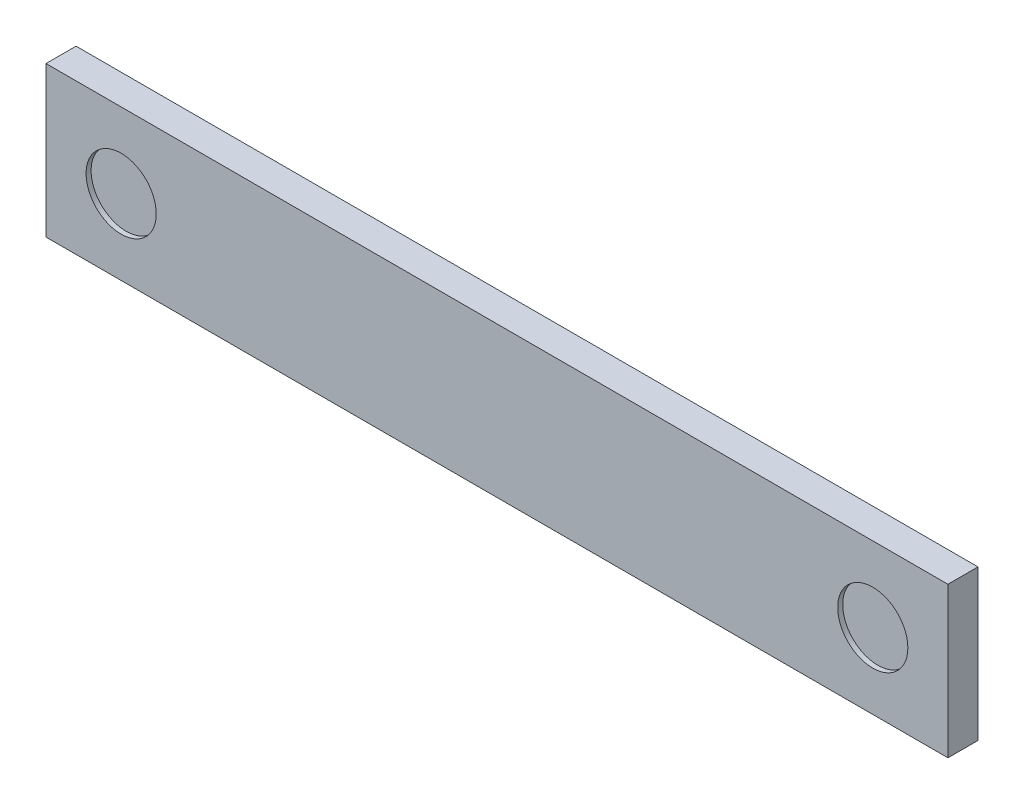
ISO-10303-21;
HEADER;
FILE_DESCRIPTION(('STEP AP214'),'2;1');
FILE_NAME('part.step','',(''),(''),'','','');
FILE_SCHEMA(('AUTOMOTIVE_DESIGN { 1 0 10303 214 1 1 1 1 }'));
ENDSEC;
DATA;
#1=APPLICATION_CONTEXT('core data for automotive mechanical design processes');
#2=APPLICATION_PROTOCOL_DEFINITION('international standard','automotive_design',2000,#1);
#3=PRODUCT_CONTEXT('',#1,'mechanical');
#4=PRODUCT('Part','Part','',(#3));
#5=PRODUCT_RELATED_PRODUCT_CATEGORY('part','',(#4));
#6=PRODUCT_DEFINITION_FORMATION('','',#4);
#7=PRODUCT_DEFINITION_CONTEXT('part definition',#1,'design');
#8=PRODUCT_DEFINITION('design','',#6,#7);
#9=PRODUCT_DEFINITION_SHAPE('','',#8);
#10=(LENGTH_UNIT() NAMED_UNIT(*) SI_UNIT(.MILLI.,.METRE.));
#11=(NAMED_UNIT(*) PLANE_ANGLE_UNIT() SI_UNIT($,.RADIAN.));
#12=(NAMED_UNIT(*) SI_UNIT($,.STERADIAN.) SOLID_ANGLE_UNIT());
#13=UNCERTAINTY_MEASURE_WITH_UNIT(LENGTH_MEASURE(1.E-05),#10,'distance_accuracy_value','');
#14=(GEOMETRIC_REPRESENTATION_CONTEXT(3) GLOBAL_UNCERTAINTY_ASSIGNED_CONTEXT((#13)) GLOBAL_UNIT_ASSIGNED_CONTEXT((#10,
#11,#12)) REPRESENTATION_CONTEXT('',''));
#15=CARTESIAN_POINT('',(0.,0.,0.));
#16=DIRECTION('',(0.,0.,1.));
#17=DIRECTION('',(1.,0.,0.));
#18=AXIS2_PLACEMENT_3D('',#15,#16,#17);
#19=CARTESIAN_POINT('',(0.,0.,60.));
#20=DIRECTION('',(-1.,0.,0.));
#21=DIRECTION('',(0.,-1.,0.));
#22=AXIS2_PLACEMENT_3D('',#19,#20,#21);
#23=PLANE('',#22);
#24=DIRECTION('',(0.,1.,0.));
#25=VECTOR('',#24,1.);
#26=CARTESIAN_POINT('',(0.,0.,0.));
#27=LINE('',#26,#25);
#28=CARTESIAN_POINT('',(0.,0.,0.));
#29=VERTEX_POINT('',#28);
#30=CARTESIAN_POINT('',(0.,300.,0.));
#31=VERTEX_POINT('',#30);
#32=EDGE_CURVE('E105',#29,#31,#27,.T.);
#33=ORIENTED_EDGE('',*,*,#32,.T.);
#34=DIRECTION('',(0.,0.,-1.));
#35=VECTOR('',#34,1.);
#36=CARTESIAN_POINT('',(0.,300.,60.));
#37=LINE('',#36,#35);
#38=CARTESIAN_POINT('',(0.,300.,60.));
#39=VERTEX_POINT('',#38);
#40=EDGE_CURVE('E11',#39,#31,#37,.T.);
#41=ORIENTED_EDGE('',*,*,#40,.F.);
#42=DIRECTION('',(0.,1.,0.));
#43=VECTOR('',#42,1.);
#44=CARTESIAN_POINT('',(0.,0.,60.));
#45=LINE('',#44,#43);
#46=CARTESIAN_POINT('',(0.,0.,60.));
#47=VERTEX_POINT('',#46);
#48=EDGE_CURVE('E89',#47,#39,#45,.T.);
#49=ORIENTED_EDGE('',*,*,#48,.F.);
#50=DIRECTION('',(0.,0.,-1.));
#51=VECTOR('',#50,1.);
#52=CARTESIAN_POINT('',(0.,0.,60.));
#53=LINE('',#52,#51);
#54=EDGE_CURVE('E98',#47,#29,#53,.T.);
#55=ORIENTED_EDGE('',*,*,#54,.T.);
#56=EDGE_LOOP('',(#33,#41,#49,#55));
#57=FACE_BOUND('',#56,.T.);
#58=ADVANCED_FACE('F39',(#57),#23,.F.);
#59=CARTESIAN_POINT('',(0.,300.,60.));
#60=DIRECTION('',(0.,-1.,0.));
#61=DIRECTION('',(1.,0.,0.));
#62=AXIS2_PLACEMENT_3D('',#59,#60,#61);
#63=PLANE('',#62);
#64=DIRECTION('',(-1.,0.,0.));
#65=VECTOR('',#64,1.);
#66=CARTESIAN_POINT('',(0.,300.,0.));
#67=LINE('',#66,#65);
#68=CARTESIAN_POINT('',(-1800.,300.,0.));
#69=VERTEX_POINT('',#68);
#70=EDGE_CURVE('E94',#31,#69,#67,.T.);
#71=ORIENTED_EDGE('',*,*,#70,.T.);
#72=DIRECTION('',(0.,0.,-1.));
#73=VECTOR('',#72,1.);
#74=CARTESIAN_POINT('',(-1800.,300.,60.));
#75=LINE('',#74,#73);
#76=CARTESIAN_POINT('',(-1800.,300.,60.));
#77=VERTEX_POINT('',#76);
#78=EDGE_CURVE('E50',#77,#69,#75,.T.);
#79=ORIENTED_EDGE('',*,*,#78,.F.);
#80=DIRECTION('',(-1.,0.,0.));
#81=VECTOR('',#80,1.);
#82=CARTESIAN_POINT('',(0.,300.,60.));
#83=LINE('',#82,#81);
#84=EDGE_CURVE('E82',#39,#77,#83,.T.);
#85=ORIENTED_EDGE('',*,*,#84,.F.);
#86=ORIENTED_EDGE('',*,*,#40,.T.);
#87=EDGE_LOOP('',(#71,#79,#85,#86));
#88=FACE_BOUND('',#87,.T.);
#89=ADVANCED_FACE('F91',(#88),#63,.F.);
#90=CARTESIAN_POINT('',(-1800.,0.,60.));
#91=DIRECTION('',(1.,0.,0.));
#92=DIRECTION('',(0.,0.,-1.));
#93=AXIS2_PLACEMENT_3D('',#90,#91,#92);
#94=PLANE('',#93);
#95=DIRECTION('',(0.,-1.,0.));
#96=VECTOR('',#95,1.);
#97=CARTESIAN_POINT('',(-1800.,0.,0.));
#98=LINE('',#97,#96);
#99=CARTESIAN_POINT('',(-1800.,0.,0.));
#100=VERTEX_POINT('',#99);
#101=EDGE_CURVE('E75',#69,#100,#98,.T.);
#102=ORIENTED_EDGE('',*,*,#101,.T.);
#103=DIRECTION('',(0.,0.,-1.));
#104=VECTOR('',#103,1.);
#105=CARTESIAN_POINT('',(-1800.,0.,60.));
#106=LINE('',#105,#104);
#107=CARTESIAN_POINT('',(-1800.,0.,60.));
#108=VERTEX_POINT('',#107);
#109=EDGE_CURVE('E92',#108,#100,#106,.T.);
#110=ORIENTED_EDGE('',*,*,#109,.F.);
#111=DIRECTION('',(0.,-1.,0.));
#112=VECTOR('',#111,1.);
#113=CARTESIAN_POINT('',(-1800.,0.,60.));
#114=LINE('',#113,#112);
#115=EDGE_CURVE('E86',#77,#108,#114,.T.);
#116=ORIENTED_EDGE('',*,*,#115,.F.);
#117=ORIENTED_EDGE('',*,*,#78,.T.);
#118=EDGE_LOOP('',(#102,#110,#116,#117));
#119=FACE_BOUND('',#118,.T.);
#120=ADVANCED_FACE('F96',(#119),#94,.F.);
#121=CARTESIAN_POINT('',(0.,0.,60.));
#122=DIRECTION('',(0.,1.,0.));
#123=DIRECTION('',(0.,0.,1.));
#124=AXIS2_PLACEMENT_3D('',#121,#122,#123);
#125=PLANE('',#124);
#126=DIRECTION('',(1.,0.,0.));
#127=VECTOR('',#126,1.);
#128=CARTESIAN_POINT('',(0.,0.,0.));
#129=LINE('',#128,#127);
#130=EDGE_CURVE('E80',#100,#29,#129,.T.);
#131=ORIENTED_EDGE('',*,*,#130,.T.);
#132=ORIENTED_EDGE('',*,*,#54,.F.);
#133=DIRECTION('',(1.,0.,0.));
#134=VECTOR('',#133,1.);
#135=CARTESIAN_POINT('',(0.,0.,60.));
#136=LINE('',#135,#134);
#137=EDGE_CURVE('E54',#108,#47,#136,.T.);
#138=ORIENTED_EDGE('',*,*,#137,.F.);
#139=ORIENTED_EDGE('',*,*,#109,.T.);
#140=EDGE_LOOP('',(#131,#132,#138,#139));
#141=FACE_BOUND('',#140,.T.);
#142=ADVANCED_FACE('F109',(#141),#125,.F.);
#143=CARTESIAN_POINT('',(0.,0.,60.));
#144=DIRECTION('',(0.,0.,1.));
#145=DIRECTION('',(1.,0.,0.));
#146=AXIS2_PLACEMENT_3D('',#143,#144,#145);
#147=PLANE('',#146);
#148=CARTESIAN_POINT('',(-150.,150.,60.));
#149=DIRECTION('',(0.,0.,1.));
#150=DIRECTION('',(1.,0.,0.));
#151=AXIS2_PLACEMENT_3D('',#148,#149,#150);
#152=CIRCLE('',#151,70.);
#153=CARTESIAN_POINT('',(-80.,150.,60.));
#154=VERTEX_POINT('',#153);
#155=EDGE_CURVE('E121',#154,#154,#152,.T.);
#156=ORIENTED_EDGE('',*,*,#155,.F.);
#157=EDGE_LOOP('',(#156));
#158=FACE_BOUND('',#157,.T.);
#159=CARTESIAN_POINT('',(-1650.,150.,60.));
#160=DIRECTION('',(0.,0.,1.));
#161=DIRECTION('',(1.,0.,0.));
#162=AXIS2_PLACEMENT_3D('',#159,#160,#161);
#163=CIRCLE('',#162,70.);
#164=CARTESIAN_POINT('',(-1580.,150.,60.));
#165=VERTEX_POINT('',#164);
#166=EDGE_CURVE('E118',#165,#165,#163,.T.);
#167=ORIENTED_EDGE('',*,*,#166,.F.);
#168=EDGE_LOOP('',(#167));
#169=FACE_BOUND('',#168,.T.);
#170=ORIENTED_EDGE('',*,*,#48,.T.);
#171=ORIENTED_EDGE('',*,*,#84,.T.);
#172=ORIENTED_EDGE('',*,*,#115,.T.);
#173=ORIENTED_EDGE('',*,*,#137,.T.);
#174=EDGE_LOOP('',(#170,#171,#172,#173));
#175=FACE_BOUND('',#174,.T.);
#176=ADVANCED_FACE('F88',(#158,#169,#175),#147,.T.);
#177=CARTESIAN_POINT('',(0.,0.,0.));
#178=DIRECTION('',(0.,0.,1.));
#179=DIRECTION('',(1.,0.,0.));
#180=AXIS2_PLACEMENT_3D('',#177,#178,#179);
#181=PLANE('',#180);
#182=ORIENTED_EDGE('',*,*,#32,.F.);
#183=ORIENTED_EDGE('',*,*,#130,.F.);
#184=ORIENTED_EDGE('',*,*,#101,.F.);
#185=ORIENTED_EDGE('',*,*,#70,.F.);
#186=EDGE_LOOP('',(#182,#183,#184,#185));
#187=FACE_BOUND('',#186,.T.);
#188=ADVANCED_FACE('F114',(#187),#181,.F.);
#189=CARTESIAN_POINT('',(-1650.,150.,50.));
#190=DIRECTION('',(0.,0.,1.));
#191=DIRECTION('',(1.,0.,0.));
#192=AXIS2_PLACEMENT_3D('',#189,#190,#191);
#193=CYLINDRICAL_SURFACE('',#192,70.);
#194=CARTESIAN_POINT('',(-1650.,150.,50.));
#195=DIRECTION('',(0.,0.,1.));
#196=DIRECTION('',(1.,0.,0.));
#197=AXIS2_PLACEMENT_3D('',#194,#195,#196);
#198=CIRCLE('',#197,70.);
#199=CARTESIAN_POINT('',(-1580.,150.,50.));
#200=VERTEX_POINT('',#199);
#201=EDGE_CURVE('E119',#200,#200,#198,.T.);
#202=ORIENTED_EDGE('',*,*,#201,.F.);
#203=EDGE_LOOP('',(#202));
#204=FACE_BOUND('',#203,.T.);
#205=ORIENTED_EDGE('',*,*,#166,.T.);
#206=EDGE_LOOP('',(#205));
#207=FACE_BOUND('',#206,.T.);
#208=ADVANCED_FACE('F142',(#204,#207),#193,.F.);
#209=CARTESIAN_POINT('',(-1650.,150.,50.));
#210=DIRECTION('',(0.,0.,1.));
#211=DIRECTION('',(1.,0.,0.));
#212=AXIS2_PLACEMENT_3D('',#209,#210,#211);
#213=PLANE('',#212);
#214=ORIENTED_EDGE('',*,*,#201,.T.);
#215=EDGE_LOOP('',(#214));
#216=FACE_BOUND('',#215,.T.);
#217=ADVANCED_FACE('F135',(#216),#213,.T.);
#218=CARTESIAN_POINT('',(-150.,150.,50.));
#219=DIRECTION('',(0.,0.,1.));
#220=DIRECTION('',(1.,0.,0.));
#221=AXIS2_PLACEMENT_3D('',#218,#219,#220);
#222=CYLINDRICAL_SURFACE('',#221,70.);
#223=CARTESIAN_POINT('',(-150.,150.,50.));
#224=DIRECTION('',(0.,0.,1.));
#225=DIRECTION('',(1.,0.,0.));
#226=AXIS2_PLACEMENT_3D('',#223,#224,#225);
#227=CIRCLE('',#226,70.);
#228=CARTESIAN_POINT('',(-80.,150.,50.));
#229=VERTEX_POINT('',#228);
#230=EDGE_CURVE('E104',#229,#229,#227,.T.);
#231=ORIENTED_EDGE('',*,*,#230,.F.);
#232=EDGE_LOOP('',(#231));
#233=FACE_BOUND('',#232,.T.);
#234=ORIENTED_EDGE('',*,*,#155,.T.);
#235=EDGE_LOOP('',(#234));
#236=FACE_BOUND('',#235,.T.);
#237=ADVANCED_FACE('F128',(#233,#236),#222,.F.);
#238=CARTESIAN_POINT('',(-150.,150.,50.));
#239=DIRECTION('',(0.,0.,1.));
#240=DIRECTION('',(1.,0.,0.));
#241=AXIS2_PLACEMENT_3D('',#238,#239,#240);
#242=PLANE('',#241);
#243=ORIENTED_EDGE('',*,*,#230,.T.);
#244=EDGE_LOOP('',(#243));
#245=FACE_BOUND('',#244,.T.);
#246=ADVANCED_FACE('F126',(#245),#242,.T.);
#247=CLOSED_SHELL('',(#58,#89,#120,#142,#176,#188,#208,#217,#237,#246));
#248=MANIFOLD_SOLID_BREP('B2',#247);
#249=ADVANCED_BREP_SHAPE_REPRESENTATION('',(#18,#248),#14);
#250=SHAPE_DEFINITION_REPRESENTATION(#9,#249);
ENDSEC;
END-ISO-10303-21;
